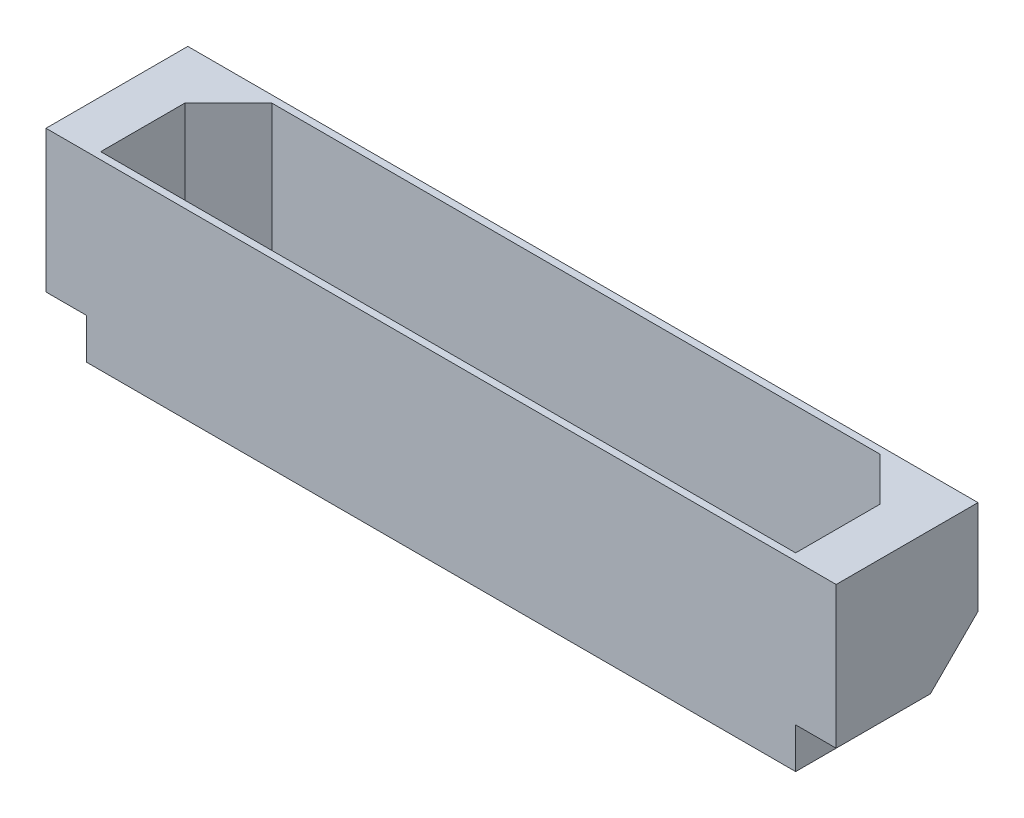
ISO-10303-21;
HEADER;
FILE_DESCRIPTION(('STEP AP214'),'2;1');
FILE_NAME('part.step','',(''),(''),'','','');
FILE_SCHEMA(('AUTOMOTIVE_DESIGN { 1 0 10303 214 1 1 1 1 }'));
ENDSEC;
DATA;
#1=APPLICATION_CONTEXT('core data for automotive mechanical design processes');
#2=APPLICATION_PROTOCOL_DEFINITION('international standard','automotive_design',2000,#1);
#3=PRODUCT_CONTEXT('',#1,'mechanical');
#4=PRODUCT('Part','Part','',(#3));
#5=PRODUCT_RELATED_PRODUCT_CATEGORY('part','',(#4));
#6=PRODUCT_DEFINITION_FORMATION('','',#4);
#7=PRODUCT_DEFINITION_CONTEXT('part definition',#1,'design');
#8=PRODUCT_DEFINITION('design','',#6,#7);
#9=PRODUCT_DEFINITION_SHAPE('','',#8);
#10=(LENGTH_UNIT() NAMED_UNIT(*) SI_UNIT(.MILLI.,.METRE.));
#11=(NAMED_UNIT(*) PLANE_ANGLE_UNIT() SI_UNIT($,.RADIAN.));
#12=(NAMED_UNIT(*) SI_UNIT($,.STERADIAN.) SOLID_ANGLE_UNIT());
#13=UNCERTAINTY_MEASURE_WITH_UNIT(LENGTH_MEASURE(1.E-05),#10,'distance_accuracy_value','');
#14=(GEOMETRIC_REPRESENTATION_CONTEXT(3) GLOBAL_UNCERTAINTY_ASSIGNED_CONTEXT((#13)) GLOBAL_UNIT_ASSIGNED_CONTEXT((#10,
#11,#12)) REPRESENTATION_CONTEXT('',''));
#15=CARTESIAN_POINT('',(0.,0.,0.));
#16=DIRECTION('',(0.,0.,1.));
#17=DIRECTION('',(1.,0.,0.));
#18=AXIS2_PLACEMENT_3D('',#15,#16,#17);
#19=CARTESIAN_POINT('',(-175.,0.,-50.));
#20=DIRECTION('',(1.,0.,0.));
#21=DIRECTION('',(0.,0.,-1.));
#22=AXIS2_PLACEMENT_3D('',#19,#20,#21);
#23=PLANE('',#22);
#24=DIRECTION('',(0.,0.,1.));
#25=VECTOR('',#24,1.);
#26=CARTESIAN_POINT('',(-175.,20.,-50.));
#27=LINE('',#26,#25);
#28=CARTESIAN_POINT('',(-175.,20.,-11.5));
#29=VERTEX_POINT('',#28);
#30=CARTESIAN_POINT('',(-175.,20.,35.));
#31=VERTEX_POINT('',#30);
#32=EDGE_CURVE('E335',#29,#31,#27,.T.);
#33=ORIENTED_EDGE('',*,*,#32,.F.);
#34=DIRECTION('',(0.,-1.,0.));
#35=VECTOR('',#34,1.);
#36=CARTESIAN_POINT('',(-175.,20.,-11.5));
#37=LINE('',#36,#35);
#38=CARTESIAN_POINT('',(-175.,0.,-11.5));
#39=VERTEX_POINT('',#38);
#40=EDGE_CURVE('E257',#29,#39,#37,.T.);
#41=ORIENTED_EDGE('',*,*,#40,.T.);
#42=DIRECTION('',(0.,0.,1.));
#43=VECTOR('',#42,1.);
#44=CARTESIAN_POINT('',(-175.,0.,0.));
#45=LINE('',#44,#43);
#46=CARTESIAN_POINT('',(-175.,0.,35.));
#47=VERTEX_POINT('',#46);
#48=EDGE_CURVE('E48',#39,#47,#45,.T.);
#49=ORIENTED_EDGE('',*,*,#48,.T.);
#50=DIRECTION('',(0.,1.,0.));
#51=VECTOR('',#50,1.);
#52=CARTESIAN_POINT('',(-175.,0.,35.));
#53=LINE('',#52,#51);
#54=EDGE_CURVE('E310',#47,#31,#53,.T.);
#55=ORIENTED_EDGE('',*,*,#54,.T.);
#56=EDGE_LOOP('',(#33,#41,#49,#55));
#57=FACE_BOUND('',#56,.T.);
#58=ADVANCED_FACE('F39',(#57),#23,.F.);
#59=CARTESIAN_POINT('',(175.,0.,-50.));
#60=DIRECTION('',(-1.,0.,0.));
#61=DIRECTION('',(0.,0.,1.));
#62=AXIS2_PLACEMENT_3D('',#59,#60,#61);
#63=PLANE('',#62);
#64=DIRECTION('',(0.,0.,-1.));
#65=VECTOR('',#64,1.);
#66=CARTESIAN_POINT('',(175.,0.,0.));
#67=LINE('',#66,#65);
#68=CARTESIAN_POINT('',(175.,0.,35.));
#69=VERTEX_POINT('',#68);
#70=CARTESIAN_POINT('',(175.,0.,-11.5));
#71=VERTEX_POINT('',#70);
#72=EDGE_CURVE('E11',#69,#71,#67,.T.);
#73=ORIENTED_EDGE('',*,*,#72,.T.);
#74=DIRECTION('',(0.,-1.,0.));
#75=VECTOR('',#74,1.);
#76=CARTESIAN_POINT('',(175.,20.,-11.5));
#77=LINE('',#76,#75);
#78=CARTESIAN_POINT('',(175.,20.,-11.5));
#79=VERTEX_POINT('',#78);
#80=EDGE_CURVE('E276',#79,#71,#77,.T.);
#81=ORIENTED_EDGE('',*,*,#80,.F.);
#82=DIRECTION('',(0.,0.,1.));
#83=VECTOR('',#82,1.);
#84=CARTESIAN_POINT('',(175.,20.,-50.));
#85=LINE('',#84,#83);
#86=CARTESIAN_POINT('',(175.,20.,35.));
#87=VERTEX_POINT('',#86);
#88=EDGE_CURVE('E322',#79,#87,#85,.T.);
#89=ORIENTED_EDGE('',*,*,#88,.T.);
#90=DIRECTION('',(0.,-1.,0.));
#91=VECTOR('',#90,1.);
#92=CARTESIAN_POINT('',(175.,0.,35.));
#93=LINE('',#92,#91);
#94=EDGE_CURVE('E317',#87,#69,#93,.T.);
#95=ORIENTED_EDGE('',*,*,#94,.T.);
#96=EDGE_LOOP('',(#73,#81,#89,#95));
#97=FACE_BOUND('',#96,.T.);
#98=ADVANCED_FACE('F401',(#97),#63,.F.);
#99=CARTESIAN_POINT('',(-195.,90.,-35.));
#100=DIRECTION('',(0.,0.,1.));
#101=DIRECTION('',(1.,0.,0.));
#102=AXIS2_PLACEMENT_3D('',#99,#100,#101);
#103=PLANE('',#102);
#104=DIRECTION('',(-1.,0.,0.));
#105=VECTOR('',#104,1.);
#106=CARTESIAN_POINT('',(-195.,0.,-35.));
#107=LINE('',#106,#105);
#108=CARTESIAN_POINT('',(151.5,0.,-35.));
#109=VERTEX_POINT('',#108);
#110=CARTESIAN_POINT('',(-151.5,0.,-35.));
#111=VERTEX_POINT('',#110);
#112=EDGE_CURVE('E346',#109,#111,#107,.T.);
#113=ORIENTED_EDGE('',*,*,#112,.T.);
#114=DIRECTION('',(0.,-1.,0.));
#115=VECTOR('',#114,1.);
#116=CARTESIAN_POINT('',(-151.5,20.,-35.));
#117=LINE('',#116,#115);
#118=CARTESIAN_POINT('',(-151.5,20.,-35.));
#119=VERTEX_POINT('',#118);
#120=EDGE_CURVE('E261',#119,#111,#117,.T.);
#121=ORIENTED_EDGE('',*,*,#120,.F.);
#122=DIRECTION('',(1.,0.,0.));
#123=VECTOR('',#122,1.);
#124=CARTESIAN_POINT('',(-151.5,20.,-35.));
#125=LINE('',#124,#123);
#126=CARTESIAN_POINT('',(-175.,20.,-35.));
#127=VERTEX_POINT('',#126);
#128=EDGE_CURVE('E253',#127,#119,#125,.T.);
#129=ORIENTED_EDGE('',*,*,#128,.F.);
#130=DIRECTION('',(0.,1.,0.));
#131=VECTOR('',#130,1.);
#132=CARTESIAN_POINT('',(-175.,90.,-35.));
#133=LINE('',#132,#131);
#134=CARTESIAN_POINT('',(-175.,43.5,-35.));
#135=VERTEX_POINT('',#134);
#136=EDGE_CURVE('E325',#127,#135,#133,.T.);
#137=ORIENTED_EDGE('',*,*,#136,.T.);
#138=DIRECTION('',(-1.,0.,0.));
#139=VECTOR('',#138,1.);
#140=CARTESIAN_POINT('',(-175.,43.5,-35.));
#141=LINE('',#140,#139);
#142=CARTESIAN_POINT('',(-195.,43.5,-35.));
#143=VERTEX_POINT('',#142);
#144=EDGE_CURVE('E292',#135,#143,#141,.T.);
#145=ORIENTED_EDGE('',*,*,#144,.T.);
#146=DIRECTION('',(0.,-1.,0.));
#147=VECTOR('',#146,1.);
#148=CARTESIAN_POINT('',(-195.,90.,-35.));
#149=LINE('',#148,#147);
#150=CARTESIAN_POINT('',(-195.,90.,-35.));
#151=VERTEX_POINT('',#150);
#152=EDGE_CURVE('E375',#151,#143,#149,.T.);
#153=ORIENTED_EDGE('',*,*,#152,.F.);
#154=DIRECTION('',(-1.,0.,0.));
#155=VECTOR('',#154,1.);
#156=CARTESIAN_POINT('',(-195.,90.,-35.));
#157=LINE('',#156,#155);
#158=CARTESIAN_POINT('',(195.,90.,-35.));
#159=VERTEX_POINT('',#158);
#160=EDGE_CURVE('E351',#159,#151,#157,.T.);
#161=ORIENTED_EDGE('',*,*,#160,.F.);
#162=DIRECTION('',(0.,-1.,0.));
#163=VECTOR('',#162,1.);
#164=CARTESIAN_POINT('',(195.,90.,-35.));
#165=LINE('',#164,#163);
#166=CARTESIAN_POINT('',(195.,43.5,-35.));
#167=VERTEX_POINT('',#166);
#168=EDGE_CURVE('E379',#159,#167,#165,.T.);
#169=ORIENTED_EDGE('',*,*,#168,.T.);
#170=DIRECTION('',(1.,0.,0.));
#171=VECTOR('',#170,1.);
#172=CARTESIAN_POINT('',(175.,43.5,-35.));
#173=LINE('',#172,#171);
#174=CARTESIAN_POINT('',(175.,43.5,-35.));
#175=VERTEX_POINT('',#174);
#176=EDGE_CURVE('E303',#175,#167,#173,.T.);
#177=ORIENTED_EDGE('',*,*,#176,.F.);
#178=DIRECTION('',(0.,-1.,0.));
#179=VECTOR('',#178,1.);
#180=CARTESIAN_POINT('',(175.,90.,-35.));
#181=LINE('',#180,#179);
#182=CARTESIAN_POINT('',(175.,20.,-35.));
#183=VERTEX_POINT('',#182);
#184=EDGE_CURVE('E342',#175,#183,#181,.T.);
#185=ORIENTED_EDGE('',*,*,#184,.T.);
#186=DIRECTION('',(1.,0.,0.));
#187=VECTOR('',#186,1.);
#188=CARTESIAN_POINT('',(151.5,20.,-35.));
#189=LINE('',#188,#187);
#190=CARTESIAN_POINT('',(151.5,20.,-35.));
#191=VERTEX_POINT('',#190);
#192=EDGE_CURVE('E63',#191,#183,#189,.T.);
#193=ORIENTED_EDGE('',*,*,#192,.F.);
#194=DIRECTION('',(0.,-1.,0.));
#195=VECTOR('',#194,1.);
#196=CARTESIAN_POINT('',(151.5,20.,-35.));
#197=LINE('',#196,#195);
#198=EDGE_CURVE('E260',#191,#109,#197,.T.);
#199=ORIENTED_EDGE('',*,*,#198,.T.);
#200=EDGE_LOOP('',(#113,#121,#129,#137,#145,#153,#161,#169,#177,#185,#193,#199));
#201=FACE_BOUND('',#200,.T.);
#202=ADVANCED_FACE('F436',(#201),#103,.F.);
#203=CARTESIAN_POINT('',(-195.,90.,35.));
#204=DIRECTION('',(1.,0.,0.));
#205=DIRECTION('',(0.,0.,-1.));
#206=AXIS2_PLACEMENT_3D('',#203,#204,#205);
#207=PLANE('',#206);
#208=DIRECTION('',(0.,-0.707106781186547,0.707106781186548));
#209=VECTOR('',#208,1.);
#210=CARTESIAN_POINT('',(-195.,20.,-11.5));
#211=LINE('',#210,#209);
#212=CARTESIAN_POINT('',(-195.,20.,-11.5));
#213=VERTEX_POINT('',#212);
#214=EDGE_CURVE('E264',#143,#213,#211,.T.);
#215=ORIENTED_EDGE('',*,*,#214,.T.);
#216=DIRECTION('',(0.,0.,1.));
#217=VECTOR('',#216,1.);
#218=CARTESIAN_POINT('',(-195.,20.,-50.));
#219=LINE('',#218,#217);
#220=CARTESIAN_POINT('',(-195.,20.,35.));
#221=VERTEX_POINT('',#220);
#222=EDGE_CURVE('E318',#213,#221,#219,.T.);
#223=ORIENTED_EDGE('',*,*,#222,.T.);
#224=DIRECTION('',(0.,-1.,0.));
#225=VECTOR('',#224,1.);
#226=CARTESIAN_POINT('',(-195.,90.,35.));
#227=LINE('',#226,#225);
#228=CARTESIAN_POINT('',(-195.,90.,35.));
#229=VERTEX_POINT('',#228);
#230=EDGE_CURVE('E371',#229,#221,#227,.T.);
#231=ORIENTED_EDGE('',*,*,#230,.F.);
#232=DIRECTION('',(0.,0.,1.));
#233=VECTOR('',#232,1.);
#234=CARTESIAN_POINT('',(-195.,90.,35.));
#235=LINE('',#234,#233);
#236=EDGE_CURVE('E355',#151,#229,#235,.T.);
#237=ORIENTED_EDGE('',*,*,#236,.F.);
#238=ORIENTED_EDGE('',*,*,#152,.T.);
#239=EDGE_LOOP('',(#215,#223,#231,#237,#238));
#240=FACE_BOUND('',#239,.T.);
#241=ADVANCED_FACE('F418',(#240),#207,.F.);
#242=CARTESIAN_POINT('',(-195.,20.,-50.));
#243=DIRECTION('',(0.,1.,0.));
#244=DIRECTION('',(0.,0.,1.));
#245=AXIS2_PLACEMENT_3D('',#242,#243,#244);
#246=PLANE('',#245);
#247=DIRECTION('',(-1.,0.,0.));
#248=VECTOR('',#247,1.);
#249=CARTESIAN_POINT('',(-175.,20.,-11.5));
#250=LINE('',#249,#248);
#251=EDGE_CURVE('E288',#29,#213,#250,.T.);
#252=ORIENTED_EDGE('',*,*,#251,.F.);
#253=ORIENTED_EDGE('',*,*,#32,.T.);
#254=DIRECTION('',(-1.,0.,0.));
#255=VECTOR('',#254,1.);
#256=CARTESIAN_POINT('',(-195.,20.,35.));
#257=LINE('',#256,#255);
#258=EDGE_CURVE('E331',#31,#221,#257,.T.);
#259=ORIENTED_EDGE('',*,*,#258,.T.);
#260=ORIENTED_EDGE('',*,*,#222,.F.);
#261=EDGE_LOOP('',(#252,#253,#259,#260));
#262=FACE_BOUND('',#261,.T.);
#263=ADVANCED_FACE('F422',(#262),#246,.F.);
#264=CARTESIAN_POINT('',(195.,90.,35.));
#265=DIRECTION('',(-1.,0.,0.));
#266=DIRECTION('',(0.,0.,1.));
#267=AXIS2_PLACEMENT_3D('',#264,#265,#266);
#268=PLANE('',#267);
#269=DIRECTION('',(0.,0.,1.));
#270=VECTOR('',#269,1.);
#271=CARTESIAN_POINT('',(195.,20.,-50.));
#272=LINE('',#271,#270);
#273=CARTESIAN_POINT('',(195.,20.,-11.5));
#274=VERTEX_POINT('',#273);
#275=CARTESIAN_POINT('',(195.,20.,35.));
#276=VERTEX_POINT('',#275);
#277=EDGE_CURVE('E321',#274,#276,#272,.T.);
#278=ORIENTED_EDGE('',*,*,#277,.F.);
#279=DIRECTION('',(0.,-0.707106781186547,0.707106781186548));
#280=VECTOR('',#279,1.);
#281=CARTESIAN_POINT('',(195.,20.,-11.5));
#282=LINE('',#281,#280);
#283=EDGE_CURVE('E296',#167,#274,#282,.T.);
#284=ORIENTED_EDGE('',*,*,#283,.F.);
#285=ORIENTED_EDGE('',*,*,#168,.F.);
#286=DIRECTION('',(0.,0.,-1.));
#287=VECTOR('',#286,1.);
#288=CARTESIAN_POINT('',(195.,90.,35.));
#289=LINE('',#288,#287);
#290=CARTESIAN_POINT('',(195.,90.,35.));
#291=VERTEX_POINT('',#290);
#292=EDGE_CURVE('E347',#291,#159,#289,.T.);
#293=ORIENTED_EDGE('',*,*,#292,.F.);
#294=DIRECTION('',(0.,-1.,0.));
#295=VECTOR('',#294,1.);
#296=CARTESIAN_POINT('',(195.,90.,35.));
#297=LINE('',#296,#295);
#298=EDGE_CURVE('E361',#291,#276,#297,.T.);
#299=ORIENTED_EDGE('',*,*,#298,.T.);
#300=EDGE_LOOP('',(#278,#284,#285,#293,#299));
#301=FACE_BOUND('',#300,.T.);
#302=ADVANCED_FACE('F41',(#301),#268,.F.);
#303=CARTESIAN_POINT('',(-195.,90.,35.));
#304=DIRECTION('',(0.,0.,-1.));
#305=DIRECTION('',(-1.,0.,0.));
#306=AXIS2_PLACEMENT_3D('',#303,#304,#305);
#307=PLANE('',#306);
#308=DIRECTION('',(1.,0.,0.));
#309=VECTOR('',#308,1.);
#310=CARTESIAN_POINT('',(-195.,0.,35.));
#311=LINE('',#310,#309);
#312=EDGE_CURVE('E352',#47,#69,#311,.T.);
#313=ORIENTED_EDGE('',*,*,#312,.T.);
#314=ORIENTED_EDGE('',*,*,#94,.F.);
#315=DIRECTION('',(-1.,0.,0.));
#316=VECTOR('',#315,1.);
#317=CARTESIAN_POINT('',(195.,20.,35.));
#318=LINE('',#317,#316);
#319=EDGE_CURVE('E313',#276,#87,#318,.T.);
#320=ORIENTED_EDGE('',*,*,#319,.F.);
#321=ORIENTED_EDGE('',*,*,#298,.F.);
#322=DIRECTION('',(1.,0.,0.));
#323=VECTOR('',#322,1.);
#324=CARTESIAN_POINT('',(-195.,90.,35.));
#325=LINE('',#324,#323);
#326=EDGE_CURVE('E358',#229,#291,#325,.T.);
#327=ORIENTED_EDGE('',*,*,#326,.F.);
#328=ORIENTED_EDGE('',*,*,#230,.T.);
#329=ORIENTED_EDGE('',*,*,#258,.F.);
#330=ORIENTED_EDGE('',*,*,#54,.F.);
#331=EDGE_LOOP('',(#313,#314,#320,#321,#327,#328,#329,#330));
#332=FACE_BOUND('',#331,.T.);
#333=ADVANCED_FACE('F393',(#332),#307,.F.);
#334=CARTESIAN_POINT('',(0.,90.,0.));
#335=DIRECTION('',(0.,-1.,0.));
#336=DIRECTION('',(0.,0.,-1.));
#337=AXIS2_PLACEMENT_3D('',#334,#335,#336);
#338=PLANE('',#337);
#339=DIRECTION('',(0.,0.,-1.));
#340=VECTOR('',#339,1.);
#341=CARTESIAN_POINT('',(171.5,90.,31.5));
#342=LINE('',#341,#340);
#343=CARTESIAN_POINT('',(171.5,90.,31.5));
#344=VERTEX_POINT('',#343);
#345=CARTESIAN_POINT('',(171.5,90.,-10.0502525316942));
#346=VERTEX_POINT('',#345);
#347=EDGE_CURVE('E217',#344,#346,#342,.T.);
#348=ORIENTED_EDGE('',*,*,#347,.F.);
#349=DIRECTION('',(1.,0.,0.));
#350=VECTOR('',#349,1.);
#351=CARTESIAN_POINT('',(-171.5,90.,31.5));
#352=LINE('',#351,#350);
#353=CARTESIAN_POINT('',(-171.5,90.,31.5));
#354=VERTEX_POINT('',#353);
#355=EDGE_CURVE('E55',#354,#344,#352,.T.);
#356=ORIENTED_EDGE('',*,*,#355,.F.);
#357=DIRECTION('',(0.,0.,1.));
#358=VECTOR('',#357,1.);
#359=CARTESIAN_POINT('',(-171.5,90.,-10.0502525316941));
#360=LINE('',#359,#358);
#361=CARTESIAN_POINT('',(-171.5,90.,-10.0502525316941));
#362=VERTEX_POINT('',#361);
#363=EDGE_CURVE('E197',#362,#354,#360,.T.);
#364=ORIENTED_EDGE('',*,*,#363,.F.);
#365=DIRECTION('',(-0.707106781186547,0.,0.707106781186548));
#366=VECTOR('',#365,1.);
#367=CARTESIAN_POINT('',(-150.050252531694,90.,-31.5));
#368=LINE('',#367,#366);
#369=CARTESIAN_POINT('',(-150.050252531694,90.,-31.5));
#370=VERTEX_POINT('',#369);
#371=EDGE_CURVE('E201',#370,#362,#368,.T.);
#372=ORIENTED_EDGE('',*,*,#371,.F.);
#373=DIRECTION('',(-1.,0.,0.));
#374=VECTOR('',#373,1.);
#375=CARTESIAN_POINT('',(150.050252531694,90.,-31.5));
#376=LINE('',#375,#374);
#377=CARTESIAN_POINT('',(150.050252531694,90.,-31.5));
#378=VERTEX_POINT('',#377);
#379=EDGE_CURVE('E224',#378,#370,#376,.T.);
#380=ORIENTED_EDGE('',*,*,#379,.F.);
#381=DIRECTION('',(-0.707106781186548,0.,-0.707106781186547));
#382=VECTOR('',#381,1.);
#383=CARTESIAN_POINT('',(171.5,90.,-10.0502525316942));
#384=LINE('',#383,#382);
#385=EDGE_CURVE('E220',#346,#378,#384,.T.);
#386=ORIENTED_EDGE('',*,*,#385,.F.);
#387=EDGE_LOOP('',(#348,#356,#364,#372,#380,#386));
#388=FACE_BOUND('',#387,.T.);
#389=ORIENTED_EDGE('',*,*,#292,.T.);
#390=ORIENTED_EDGE('',*,*,#160,.T.);
#391=ORIENTED_EDGE('',*,*,#236,.T.);
#392=ORIENTED_EDGE('',*,*,#326,.T.);
#393=EDGE_LOOP('',(#389,#390,#391,#392));
#394=FACE_BOUND('',#393,.T.);
#395=ADVANCED_FACE('F413',(#388,#394),#338,.F.);
#396=CARTESIAN_POINT('',(0.,0.,0.));
#397=DIRECTION('',(0.,-1.,0.));
#398=DIRECTION('',(0.,0.,-1.));
#399=AXIS2_PLACEMENT_3D('',#396,#397,#398);
#400=PLANE('',#399);
#401=DIRECTION('',(-0.707106781186547,0.,0.707106781186548));
#402=VECTOR('',#401,1.);
#403=CARTESIAN_POINT('',(-175.,0.,-11.5));
#404=LINE('',#403,#402);
#405=EDGE_CURVE('E250',#111,#39,#404,.T.);
#406=ORIENTED_EDGE('',*,*,#405,.F.);
#407=ORIENTED_EDGE('',*,*,#112,.F.);
#408=DIRECTION('',(-0.707106781186547,0.,-0.707106781186548));
#409=VECTOR('',#408,1.);
#410=CARTESIAN_POINT('',(175.,0.,-11.5));
#411=LINE('',#410,#409);
#412=EDGE_CURVE('E234',#71,#109,#411,.T.);
#413=ORIENTED_EDGE('',*,*,#412,.F.);
#414=ORIENTED_EDGE('',*,*,#72,.F.);
#415=ORIENTED_EDGE('',*,*,#312,.F.);
#416=ORIENTED_EDGE('',*,*,#48,.F.);
#417=EDGE_LOOP('',(#406,#407,#413,#414,#415,#416));
#418=FACE_BOUND('',#417,.T.);
#419=ADVANCED_FACE('F396',(#418),#400,.T.);
#420=ORIENTED_EDGE('',*,*,#136,.F.);
#421=DIRECTION('',(0.,0.,-1.));
#422=VECTOR('',#421,1.);
#423=CARTESIAN_POINT('',(-175.,20.,-35.));
#424=LINE('',#423,#422);
#425=EDGE_CURVE('E249',#29,#127,#424,.T.);
#426=ORIENTED_EDGE('',*,*,#425,.F.);
#427=DIRECTION('',(0.,-0.707106781186547,0.707106781186548));
#428=VECTOR('',#427,1.);
#429=CARTESIAN_POINT('',(-175.,20.,-11.5));
#430=LINE('',#429,#428);
#431=EDGE_CURVE('E284',#135,#29,#430,.T.);
#432=ORIENTED_EDGE('',*,*,#431,.F.);
#433=EDGE_LOOP('',(#420,#426,#432));
#434=FACE_BOUND('',#433,.T.);
#435=ADVANCED_FACE('F430',(#434),#23,.F.);
#436=CARTESIAN_POINT('',(195.,20.,-50.));
#437=DIRECTION('',(0.,1.,0.));
#438=DIRECTION('',(-1.,0.,0.));
#439=AXIS2_PLACEMENT_3D('',#436,#437,#438);
#440=PLANE('',#439);
#441=ORIENTED_EDGE('',*,*,#88,.F.);
#442=DIRECTION('',(1.,0.,0.));
#443=VECTOR('',#442,1.);
#444=CARTESIAN_POINT('',(175.,20.,-11.5));
#445=LINE('',#444,#443);
#446=EDGE_CURVE('E306',#79,#274,#445,.T.);
#447=ORIENTED_EDGE('',*,*,#446,.T.);
#448=ORIENTED_EDGE('',*,*,#277,.T.);
#449=ORIENTED_EDGE('',*,*,#319,.T.);
#450=EDGE_LOOP('',(#441,#447,#448,#449));
#451=FACE_BOUND('',#450,.T.);
#452=ADVANCED_FACE('F459',(#451),#440,.F.);
#453=DIRECTION('',(0.,-0.707106781186547,0.707106781186548));
#454=VECTOR('',#453,1.);
#455=CARTESIAN_POINT('',(175.,20.,-11.5));
#456=LINE('',#455,#454);
#457=EDGE_CURVE('E299',#175,#79,#456,.T.);
#458=ORIENTED_EDGE('',*,*,#457,.T.);
#459=DIRECTION('',(0.,0.,1.));
#460=VECTOR('',#459,1.);
#461=CARTESIAN_POINT('',(175.,20.,-35.));
#462=LINE('',#461,#460);
#463=EDGE_CURVE('E268',#183,#79,#462,.T.);
#464=ORIENTED_EDGE('',*,*,#463,.F.);
#465=ORIENTED_EDGE('',*,*,#184,.F.);
#466=EDGE_LOOP('',(#458,#464,#465));
#467=FACE_BOUND('',#466,.T.);
#468=ADVANCED_FACE('F455',(#467),#63,.F.);
#469=CARTESIAN_POINT('',(175.,20.,-11.5));
#470=DIRECTION('',(0.,0.707106781186548,0.707106781186547));
#471=DIRECTION('',(0.,-0.707106781186547,0.707106781186548));
#472=AXIS2_PLACEMENT_3D('',#469,#470,#471);
#473=PLANE('',#472);
#474=ORIENTED_EDGE('',*,*,#283,.T.);
#475=ORIENTED_EDGE('',*,*,#446,.F.);
#476=ORIENTED_EDGE('',*,*,#457,.F.);
#477=ORIENTED_EDGE('',*,*,#176,.T.);
#478=EDGE_LOOP('',(#474,#475,#476,#477));
#479=FACE_BOUND('',#478,.T.);
#480=ADVANCED_FACE('F619',(#479),#473,.F.);
#481=CARTESIAN_POINT('',(-175.,20.,-11.5));
#482=DIRECTION('',(0.,-0.707106781186548,-0.707106781186547));
#483=DIRECTION('',(0.,0.707106781186547,-0.707106781186548));
#484=AXIS2_PLACEMENT_3D('',#481,#482,#483);
#485=PLANE('',#484);
#486=ORIENTED_EDGE('',*,*,#214,.F.);
#487=ORIENTED_EDGE('',*,*,#144,.F.);
#488=ORIENTED_EDGE('',*,*,#431,.T.);
#489=ORIENTED_EDGE('',*,*,#251,.T.);
#490=EDGE_LOOP('',(#486,#487,#488,#489));
#491=FACE_BOUND('',#490,.T.);
#492=ADVANCED_FACE('F424',(#491),#485,.T.);
#493=CARTESIAN_POINT('',(175.,20.,-11.5));
#494=DIRECTION('',(-0.707106781186548,0.,0.707106781186547));
#495=DIRECTION('',(0.707106781186547,0.,0.707106781186548));
#496=AXIS2_PLACEMENT_3D('',#493,#494,#495);
#497=PLANE('',#496);
#498=ORIENTED_EDGE('',*,*,#412,.T.);
#499=ORIENTED_EDGE('',*,*,#198,.F.);
#500=DIRECTION('',(-0.707106781186547,0.,-0.707106781186548));
#501=VECTOR('',#500,1.);
#502=CARTESIAN_POINT('',(175.,20.,-11.5));
#503=LINE('',#502,#501);
#504=EDGE_CURVE('E271',#79,#191,#503,.T.);
#505=ORIENTED_EDGE('',*,*,#504,.F.);
#506=ORIENTED_EDGE('',*,*,#80,.T.);
#507=EDGE_LOOP('',(#498,#499,#505,#506));
#508=FACE_BOUND('',#507,.T.);
#509=ADVANCED_FACE('F447',(#508),#497,.F.);
#510=CARTESIAN_POINT('',(0.,20.,0.));
#511=DIRECTION('',(0.,1.,0.));
#512=DIRECTION('',(0.,0.,1.));
#513=AXIS2_PLACEMENT_3D('',#510,#511,#512);
#514=PLANE('',#513);
#515=ORIENTED_EDGE('',*,*,#463,.T.);
#516=ORIENTED_EDGE('',*,*,#504,.T.);
#517=ORIENTED_EDGE('',*,*,#192,.T.);
#518=EDGE_LOOP('',(#515,#516,#517));
#519=FACE_BOUND('',#518,.T.);
#520=ADVANCED_FACE('F440',(#519),#514,.F.);
#521=CARTESIAN_POINT('',(-175.,20.,-11.5));
#522=DIRECTION('',(0.707106781186548,0.,0.707106781186547));
#523=DIRECTION('',(0.707106781186547,0.,-0.707106781186548));
#524=AXIS2_PLACEMENT_3D('',#521,#522,#523);
#525=PLANE('',#524);
#526=ORIENTED_EDGE('',*,*,#405,.T.);
#527=ORIENTED_EDGE('',*,*,#40,.F.);
#528=DIRECTION('',(-0.707106781186547,0.,0.707106781186548));
#529=VECTOR('',#528,1.);
#530=CARTESIAN_POINT('',(-175.,20.,-11.5));
#531=LINE('',#530,#529);
#532=EDGE_CURVE('E246',#119,#29,#531,.T.);
#533=ORIENTED_EDGE('',*,*,#532,.F.);
#534=ORIENTED_EDGE('',*,*,#120,.T.);
#535=EDGE_LOOP('',(#526,#527,#533,#534));
#536=FACE_BOUND('',#535,.T.);
#537=ADVANCED_FACE('F438',(#536),#525,.F.);
#538=CARTESIAN_POINT('',(0.,20.,0.));
#539=DIRECTION('',(0.,1.,0.));
#540=DIRECTION('',(0.,0.,1.));
#541=AXIS2_PLACEMENT_3D('',#538,#539,#540);
#542=PLANE('',#541);
#543=ORIENTED_EDGE('',*,*,#532,.T.);
#544=ORIENTED_EDGE('',*,*,#425,.T.);
#545=ORIENTED_EDGE('',*,*,#128,.T.);
#546=EDGE_LOOP('',(#543,#544,#545));
#547=FACE_BOUND('',#546,.T.);
#548=ADVANCED_FACE('F433',(#547),#542,.F.);
#549=CARTESIAN_POINT('',(-171.5,3.5,31.5));
#550=DIRECTION('',(0.,0.,1.));
#551=DIRECTION('',(1.,0.,0.));
#552=AXIS2_PLACEMENT_3D('',#549,#550,#551);
#553=PLANE('',#552);
#554=ORIENTED_EDGE('',*,*,#355,.T.);
#555=DIRECTION('',(0.,1.,0.));
#556=VECTOR('',#555,1.);
#557=CARTESIAN_POINT('',(171.5,3.5,31.5));
#558=LINE('',#557,#556);
#559=CARTESIAN_POINT('',(171.5,3.5,31.5));
#560=VERTEX_POINT('',#559);
#561=EDGE_CURVE('E171',#560,#344,#558,.T.);
#562=ORIENTED_EDGE('',*,*,#561,.F.);
#563=DIRECTION('',(1.,0.,0.));
#564=VECTOR('',#563,1.);
#565=CARTESIAN_POINT('',(-171.5,3.5,31.5));
#566=LINE('',#565,#564);
#567=CARTESIAN_POINT('',(-171.5,3.5,31.5));
#568=VERTEX_POINT('',#567);
#569=EDGE_CURVE('E175',#568,#560,#566,.T.);
#570=ORIENTED_EDGE('',*,*,#569,.F.);
#571=DIRECTION('',(0.,1.,0.));
#572=VECTOR('',#571,1.);
#573=CARTESIAN_POINT('',(-171.5,3.5,31.5));
#574=LINE('',#573,#572);
#575=EDGE_CURVE('E231',#568,#354,#574,.T.);
#576=ORIENTED_EDGE('',*,*,#575,.T.);
#577=EDGE_LOOP('',(#554,#562,#570,#576));
#578=FACE_BOUND('',#577,.T.);
#579=ADVANCED_FACE('F173',(#578),#553,.F.);
#580=CARTESIAN_POINT('',(-171.5,3.5,-10.0502525316941));
#581=DIRECTION('',(-1.,0.,0.));
#582=DIRECTION('',(0.,0.,1.));
#583=AXIS2_PLACEMENT_3D('',#580,#581,#582);
#584=PLANE('',#583);
#585=ORIENTED_EDGE('',*,*,#363,.T.);
#586=ORIENTED_EDGE('',*,*,#575,.F.);
#587=DIRECTION('',(0.,0.,1.));
#588=VECTOR('',#587,1.);
#589=CARTESIAN_POINT('',(-171.5,3.5,-10.0502525316941));
#590=LINE('',#589,#588);
#591=CARTESIAN_POINT('',(-171.5,3.5,-10.0502525316941));
#592=VERTEX_POINT('',#591);
#593=EDGE_CURVE('E182',#592,#568,#590,.T.);
#594=ORIENTED_EDGE('',*,*,#593,.F.);
#595=DIRECTION('',(0.,1.,0.));
#596=VECTOR('',#595,1.);
#597=CARTESIAN_POINT('',(-171.5,3.5,-10.0502525316941));
#598=LINE('',#597,#596);
#599=EDGE_CURVE('E235',#592,#362,#598,.T.);
#600=ORIENTED_EDGE('',*,*,#599,.T.);
#601=EDGE_LOOP('',(#585,#586,#594,#600));
#602=FACE_BOUND('',#601,.T.);
#603=ADVANCED_FACE('F514',(#602),#584,.F.);
#604=CARTESIAN_POINT('',(-150.050252531694,3.5,-31.5));
#605=DIRECTION('',(-0.707106781186548,0.,-0.707106781186547));
#606=DIRECTION('',(-0.707106781186547,0.,0.707106781186548));
#607=AXIS2_PLACEMENT_3D('',#604,#605,#606);
#608=PLANE('',#607);
#609=ORIENTED_EDGE('',*,*,#371,.T.);
#610=ORIENTED_EDGE('',*,*,#599,.F.);
#611=DIRECTION('',(-0.707106781186547,0.,0.707106781186548));
#612=VECTOR('',#611,1.);
#613=CARTESIAN_POINT('',(-150.050252531694,3.5,-31.5));
#614=LINE('',#613,#612);
#615=CARTESIAN_POINT('',(-150.050252531694,3.5,-31.5));
#616=VERTEX_POINT('',#615);
#617=EDGE_CURVE('E210',#616,#592,#614,.T.);
#618=ORIENTED_EDGE('',*,*,#617,.F.);
#619=DIRECTION('',(0.,1.,0.));
#620=VECTOR('',#619,1.);
#621=CARTESIAN_POINT('',(-150.050252531694,3.5,-31.5));
#622=LINE('',#621,#620);
#623=EDGE_CURVE('E238',#616,#370,#622,.T.);
#624=ORIENTED_EDGE('',*,*,#623,.T.);
#625=EDGE_LOOP('',(#609,#610,#618,#624));
#626=FACE_BOUND('',#625,.T.);
#627=ADVANCED_FACE('F523',(#626),#608,.F.);
#628=CARTESIAN_POINT('',(150.050252531694,3.5,-31.5));
#629=DIRECTION('',(0.,0.,-1.));
#630=DIRECTION('',(-1.,0.,0.));
#631=AXIS2_PLACEMENT_3D('',#628,#629,#630);
#632=PLANE('',#631);
#633=ORIENTED_EDGE('',*,*,#379,.T.);
#634=ORIENTED_EDGE('',*,*,#623,.F.);
#635=DIRECTION('',(-1.,0.,0.));
#636=VECTOR('',#635,1.);
#637=CARTESIAN_POINT('',(150.050252531694,3.5,-31.5));
#638=LINE('',#637,#636);
#639=CARTESIAN_POINT('',(150.050252531694,3.5,-31.5));
#640=VERTEX_POINT('',#639);
#641=EDGE_CURVE('E206',#640,#616,#638,.T.);
#642=ORIENTED_EDGE('',*,*,#641,.F.);
#643=DIRECTION('',(0.,1.,0.));
#644=VECTOR('',#643,1.);
#645=CARTESIAN_POINT('',(150.050252531694,3.5,-31.5));
#646=LINE('',#645,#644);
#647=EDGE_CURVE('E241',#640,#378,#646,.T.);
#648=ORIENTED_EDGE('',*,*,#647,.T.);
#649=EDGE_LOOP('',(#633,#634,#642,#648));
#650=FACE_BOUND('',#649,.T.);
#651=ADVANCED_FACE('F533',(#650),#632,.F.);
#652=CARTESIAN_POINT('',(171.5,3.5,-10.0502525316942));
#653=DIRECTION('',(0.707106781186547,0.,-0.707106781186548));
#654=DIRECTION('',(-0.707106781186548,0.,-0.707106781186547));
#655=AXIS2_PLACEMENT_3D('',#652,#653,#654);
#656=PLANE('',#655);
#657=ORIENTED_EDGE('',*,*,#385,.T.);
#658=ORIENTED_EDGE('',*,*,#647,.F.);
#659=DIRECTION('',(-0.707106781186548,0.,-0.707106781186547));
#660=VECTOR('',#659,1.);
#661=CARTESIAN_POINT('',(171.5,3.5,-10.0502525316942));
#662=LINE('',#661,#660);
#663=CARTESIAN_POINT('',(171.5,3.5,-10.0502525316942));
#664=VERTEX_POINT('',#663);
#665=EDGE_CURVE('E191',#664,#640,#662,.T.);
#666=ORIENTED_EDGE('',*,*,#665,.F.);
#667=DIRECTION('',(0.,1.,0.));
#668=VECTOR('',#667,1.);
#669=CARTESIAN_POINT('',(171.5,3.5,-10.0502525316942));
#670=LINE('',#669,#668);
#671=EDGE_CURVE('E181',#664,#346,#670,.T.);
#672=ORIENTED_EDGE('',*,*,#671,.T.);
#673=EDGE_LOOP('',(#657,#658,#666,#672));
#674=FACE_BOUND('',#673,.T.);
#675=ADVANCED_FACE('F543',(#674),#656,.F.);
#676=CARTESIAN_POINT('',(171.5,3.5,31.5));
#677=DIRECTION('',(1.,0.,0.));
#678=DIRECTION('',(0.,0.,-1.));
#679=AXIS2_PLACEMENT_3D('',#676,#677,#678);
#680=PLANE('',#679);
#681=ORIENTED_EDGE('',*,*,#347,.T.);
#682=ORIENTED_EDGE('',*,*,#671,.F.);
#683=DIRECTION('',(0.,0.,-1.));
#684=VECTOR('',#683,1.);
#685=CARTESIAN_POINT('',(171.5,3.5,31.5));
#686=LINE('',#685,#684);
#687=EDGE_CURVE('E185',#560,#664,#686,.T.);
#688=ORIENTED_EDGE('',*,*,#687,.F.);
#689=ORIENTED_EDGE('',*,*,#561,.T.);
#690=EDGE_LOOP('',(#681,#682,#688,#689));
#691=FACE_BOUND('',#690,.T.);
#692=ADVANCED_FACE('F186',(#691),#680,.F.);
#693=CARTESIAN_POINT('',(0.,3.5,0.));
#694=DIRECTION('',(0.,1.,0.));
#695=DIRECTION('',(0.,0.,1.));
#696=AXIS2_PLACEMENT_3D('',#693,#694,#695);
#697=PLANE('',#696);
#698=ORIENTED_EDGE('',*,*,#569,.T.);
#699=ORIENTED_EDGE('',*,*,#687,.T.);
#700=ORIENTED_EDGE('',*,*,#665,.T.);
#701=ORIENTED_EDGE('',*,*,#641,.T.);
#702=ORIENTED_EDGE('',*,*,#617,.T.);
#703=ORIENTED_EDGE('',*,*,#593,.T.);
#704=EDGE_LOOP('',(#698,#699,#700,#701,#702,#703));
#705=FACE_BOUND('',#704,.T.);
#706=ADVANCED_FACE('F193',(#705),#697,.T.);
#707=CLOSED_SHELL('',(#58,#98,#202,#241,#263,#302,#333,#395,#419,#435,#452,#468,#480,#492,#509,
#520,#537,#548,#579,#603,#627,#651,#675,#692,#706));
#708=MANIFOLD_SOLID_BREP('B2',#707);
#709=ADVANCED_BREP_SHAPE_REPRESENTATION('',(#18,#708),#14);
#710=SHAPE_DEFINITION_REPRESENTATION(#9,#709);
ENDSEC;
END-ISO-10303-21;
